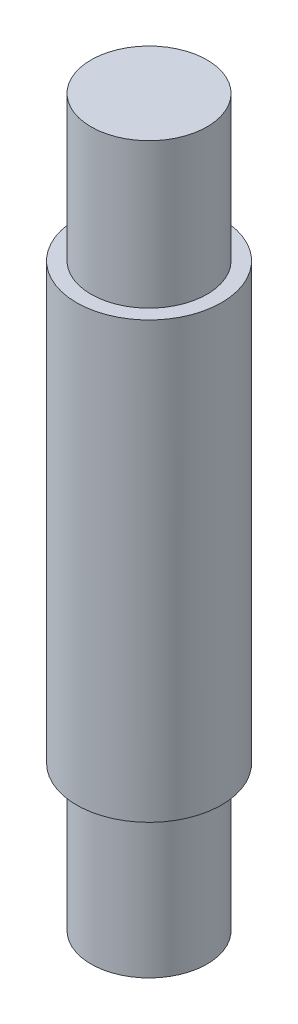
ISO-10303-21;
HEADER;
FILE_DESCRIPTION(('STEP AP214'),'2;1');
FILE_NAME('part.step','',(''),(''),'','','');
FILE_SCHEMA(('AUTOMOTIVE_DESIGN { 1 0 10303 214 1 1 1 1 }'));
ENDSEC;
DATA;
#1=APPLICATION_CONTEXT('core data for automotive mechanical design processes');
#2=APPLICATION_PROTOCOL_DEFINITION('international standard','automotive_design',2000,#1);
#3=PRODUCT_CONTEXT('',#1,'mechanical');
#4=PRODUCT('Part','Part','',(#3));
#5=PRODUCT_RELATED_PRODUCT_CATEGORY('part','',(#4));
#6=PRODUCT_DEFINITION_FORMATION('','',#4);
#7=PRODUCT_DEFINITION_CONTEXT('part definition',#1,'design');
#8=PRODUCT_DEFINITION('design','',#6,#7);
#9=PRODUCT_DEFINITION_SHAPE('','',#8);
#10=(LENGTH_UNIT() NAMED_UNIT(*) SI_UNIT(.MILLI.,.METRE.));
#11=(NAMED_UNIT(*) PLANE_ANGLE_UNIT() SI_UNIT($,.RADIAN.));
#12=(NAMED_UNIT(*) SI_UNIT($,.STERADIAN.) SOLID_ANGLE_UNIT());
#13=UNCERTAINTY_MEASURE_WITH_UNIT(LENGTH_MEASURE(1.E-05),#10,'distance_accuracy_value','');
#14=(GEOMETRIC_REPRESENTATION_CONTEXT(3) GLOBAL_UNCERTAINTY_ASSIGNED_CONTEXT((#13)) GLOBAL_UNIT_ASSIGNED_CONTEXT((#10,
#11,#12)) REPRESENTATION_CONTEXT('',''));
#15=CARTESIAN_POINT('',(0.,0.,0.));
#16=DIRECTION('',(0.,0.,1.));
#17=DIRECTION('',(1.,0.,0.));
#18=AXIS2_PLACEMENT_3D('',#15,#16,#17);
#19=CARTESIAN_POINT('',(0.,50.,0.));
#20=DIRECTION('',(0.,-1.,0.));
#21=DIRECTION('',(0.,0.,-1.));
#22=AXIS2_PLACEMENT_3D('',#19,#20,#21);
#23=CYLINDRICAL_SURFACE('',#22,5.);
#24=CARTESIAN_POINT('',(0.,40.,0.));
#25=DIRECTION('',(0.,1.,0.));
#26=DIRECTION('',(0.,0.,1.));
#27=AXIS2_PLACEMENT_3D('',#24,#25,#26);
#28=CIRCLE('',#27,5.);
#29=CARTESIAN_POINT('',(0.,40.,5.));
#30=VERTEX_POINT('',#29);
#31=EDGE_CURVE('E10',#30,#30,#28,.T.);
#32=ORIENTED_EDGE('',*,*,#31,.F.);
#33=EDGE_LOOP('',(#32));
#34=FACE_BOUND('',#33,.T.);
#35=CARTESIAN_POINT('',(0.,10.,0.));
#36=DIRECTION('',(0.,-1.,0.));
#37=DIRECTION('',(0.,0.,-1.));
#38=AXIS2_PLACEMENT_3D('',#35,#36,#37);
#39=CIRCLE('',#38,5.);
#40=CARTESIAN_POINT('',(0.,10.,-5.));
#41=VERTEX_POINT('',#40);
#42=EDGE_CURVE('E54',#41,#41,#39,.T.);
#43=ORIENTED_EDGE('',*,*,#42,.F.);
#44=EDGE_LOOP('',(#43));
#45=FACE_BOUND('',#44,.T.);
#46=ADVANCED_FACE('F38',(#34,#45),#23,.T.);
#47=CARTESIAN_POINT('',(0.,40.,0.));
#48=DIRECTION('',(0.,1.,0.));
#49=DIRECTION('',(0.,0.,1.));
#50=AXIS2_PLACEMENT_3D('',#47,#48,#49);
#51=PLANE('',#50);
#52=CARTESIAN_POINT('',(0.,40.,0.));
#53=DIRECTION('',(0.,1.,0.));
#54=DIRECTION('',(0.,0.,1.));
#55=AXIS2_PLACEMENT_3D('',#52,#53,#54);
#56=CIRCLE('',#55,4.);
#57=CARTESIAN_POINT('',(0.,40.,4.));
#58=VERTEX_POINT('',#57);
#59=EDGE_CURVE('E44',#58,#58,#56,.T.);
#60=ORIENTED_EDGE('',*,*,#59,.F.);
#61=EDGE_LOOP('',(#60));
#62=FACE_BOUND('',#61,.T.);
#63=ORIENTED_EDGE('',*,*,#31,.T.);
#64=EDGE_LOOP('',(#63));
#65=FACE_BOUND('',#64,.T.);
#66=ADVANCED_FACE('F76',(#62,#65),#51,.T.);
#67=CARTESIAN_POINT('',(0.,40.,0.));
#68=DIRECTION('',(0.,1.,0.));
#69=DIRECTION('',(0.,0.,1.));
#70=AXIS2_PLACEMENT_3D('',#67,#68,#69);
#71=CYLINDRICAL_SURFACE('',#70,4.);
#72=ORIENTED_EDGE('',*,*,#59,.T.);
#73=EDGE_LOOP('',(#72));
#74=FACE_BOUND('',#73,.T.);
#75=CARTESIAN_POINT('',(0.,50.,0.));
#76=DIRECTION('',(0.,1.,0.));
#77=DIRECTION('',(0.,0.,1.));
#78=AXIS2_PLACEMENT_3D('',#75,#76,#77);
#79=CIRCLE('',#78,4.);
#80=CARTESIAN_POINT('',(0.,50.,4.));
#81=VERTEX_POINT('',#80);
#82=EDGE_CURVE('E48',#81,#81,#79,.T.);
#83=ORIENTED_EDGE('',*,*,#82,.F.);
#84=EDGE_LOOP('',(#83));
#85=FACE_BOUND('',#84,.T.);
#86=ADVANCED_FACE('F81',(#74,#85),#71,.T.);
#87=CARTESIAN_POINT('',(0.,50.,0.));
#88=DIRECTION('',(0.,1.,0.));
#89=DIRECTION('',(0.,0.,1.));
#90=AXIS2_PLACEMENT_3D('',#87,#88,#89);
#91=PLANE('',#90);
#92=ORIENTED_EDGE('',*,*,#82,.T.);
#93=EDGE_LOOP('',(#92));
#94=FACE_BOUND('',#93,.T.);
#95=ADVANCED_FACE('F71',(#94),#91,.T.);
#96=CARTESIAN_POINT('',(0.,10.,0.));
#97=DIRECTION('',(0.,-1.,0.));
#98=DIRECTION('',(0.,0.,-1.));
#99=AXIS2_PLACEMENT_3D('',#96,#97,#98);
#100=PLANE('',#99);
#101=CARTESIAN_POINT('',(0.,10.,0.));
#102=DIRECTION('',(0.,-1.,0.));
#103=DIRECTION('',(0.,0.,-1.));
#104=AXIS2_PLACEMENT_3D('',#101,#102,#103);
#105=CIRCLE('',#104,4.);
#106=CARTESIAN_POINT('',(0.,10.,-4.));
#107=VERTEX_POINT('',#106);
#108=EDGE_CURVE('E58',#107,#107,#105,.T.);
#109=ORIENTED_EDGE('',*,*,#108,.F.);
#110=EDGE_LOOP('',(#109));
#111=FACE_BOUND('',#110,.T.);
#112=ORIENTED_EDGE('',*,*,#42,.T.);
#113=EDGE_LOOP('',(#112));
#114=FACE_BOUND('',#113,.T.);
#115=ADVANCED_FACE('F68',(#111,#114),#100,.T.);
#116=CARTESIAN_POINT('',(0.,10.,0.));
#117=DIRECTION('',(0.,-1.,0.));
#118=DIRECTION('',(0.,0.,-1.));
#119=AXIS2_PLACEMENT_3D('',#116,#117,#118);
#120=CYLINDRICAL_SURFACE('',#119,4.);
#121=ORIENTED_EDGE('',*,*,#108,.T.);
#122=EDGE_LOOP('',(#121));
#123=FACE_BOUND('',#122,.T.);
#124=CARTESIAN_POINT('',(0.,0.,0.));
#125=DIRECTION('',(0.,-1.,0.));
#126=DIRECTION('',(0.,0.,-1.));
#127=AXIS2_PLACEMENT_3D('',#124,#125,#126);
#128=CIRCLE('',#127,4.);
#129=CARTESIAN_POINT('',(0.,0.,-4.));
#130=VERTEX_POINT('',#129);
#131=EDGE_CURVE('E59',#130,#130,#128,.T.);
#132=ORIENTED_EDGE('',*,*,#131,.F.);
#133=EDGE_LOOP('',(#132));
#134=FACE_BOUND('',#133,.T.);
#135=ADVANCED_FACE('F65',(#123,#134),#120,.T.);
#136=CARTESIAN_POINT('',(0.,0.,0.));
#137=DIRECTION('',(0.,1.,0.));
#138=DIRECTION('',(0.,0.,1.));
#139=AXIS2_PLACEMENT_3D('',#136,#137,#138);
#140=PLANE('',#139);
#141=ORIENTED_EDGE('',*,*,#131,.T.);
#142=EDGE_LOOP('',(#141));
#143=FACE_BOUND('',#142,.T.);
#144=ADVANCED_FACE('F91',(#143),#140,.F.);
#145=CLOSED_SHELL('',(#46,#66,#86,#95,#115,#135,#144));
#146=MANIFOLD_SOLID_BREP('B2',#145);
#147=ADVANCED_BREP_SHAPE_REPRESENTATION('',(#18,#146),#14);
#148=SHAPE_DEFINITION_REPRESENTATION(#9,#147);
ENDSEC;
END-ISO-10303-21;
